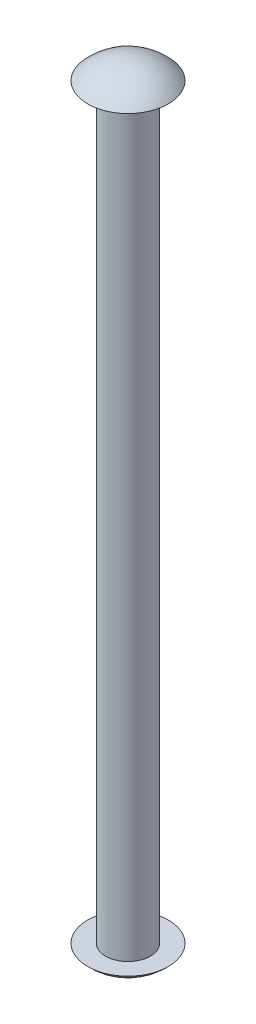
ISO-10303-21;
HEADER;
FILE_DESCRIPTION(('STEP AP214'),'2;1');
FILE_NAME('part.step','',(''),(''),'','','');
FILE_SCHEMA(('AUTOMOTIVE_DESIGN { 1 0 10303 214 1 1 1 1 }'));
ENDSEC;
DATA;
#1=APPLICATION_CONTEXT('core data for automotive mechanical design processes');
#2=APPLICATION_PROTOCOL_DEFINITION('international standard','automotive_design',2000,#1);
#3=PRODUCT_CONTEXT('',#1,'mechanical');
#4=PRODUCT('Part','Part','',(#3));
#5=PRODUCT_RELATED_PRODUCT_CATEGORY('part','',(#4));
#6=PRODUCT_DEFINITION_FORMATION('','',#4);
#7=PRODUCT_DEFINITION_CONTEXT('part definition',#1,'design');
#8=PRODUCT_DEFINITION('design','',#6,#7);
#9=PRODUCT_DEFINITION_SHAPE('','',#8);
#10=(LENGTH_UNIT() NAMED_UNIT(*) SI_UNIT(.MILLI.,.METRE.));
#11=(NAMED_UNIT(*) PLANE_ANGLE_UNIT() SI_UNIT($,.RADIAN.));
#12=(NAMED_UNIT(*) SI_UNIT($,.STERADIAN.) SOLID_ANGLE_UNIT());
#13=UNCERTAINTY_MEASURE_WITH_UNIT(LENGTH_MEASURE(1.E-05),#10,'distance_accuracy_value','');
#14=(GEOMETRIC_REPRESENTATION_CONTEXT(3) GLOBAL_UNCERTAINTY_ASSIGNED_CONTEXT((#13)) GLOBAL_UNIT_ASSIGNED_CONTEXT((#10,
#11,#12)) REPRESENTATION_CONTEXT('',''));
#15=CARTESIAN_POINT('',(0.,0.,0.));
#16=DIRECTION('',(0.,0.,1.));
#17=DIRECTION('',(1.,0.,0.));
#18=AXIS2_PLACEMENT_3D('',#15,#16,#17);
#19=CARTESIAN_POINT('',(0.,-11.2820472624,0.));
#20=DIRECTION('',(-0.479425538604204,0.,0.877582561890372));
#21=DIRECTION('',(-0.877582561890372,0.,-0.479425538604204));
#22=AXIS2_PLACEMENT_3D('',#19,#20,#21);
#23=SPHERICAL_SURFACE('',#22,1.81795273756);
#24=CARTESIAN_POINT('',(-0.647054575696604,-12.5,1.1844254560945));
#25=CARTESIAN_POINT('',(-0.580572309359393,-12.5,1.22073999622456));
#26=CARTESIAN_POINT('',(-0.510901264459944,-12.5,1.25149872853444));
#27=CARTESIAN_POINT('',(-0.403335343725967,-12.5,1.28853208592338));
#28=CARTESIAN_POINT('',(-0.366920460423315,-12.5,1.29936727502871));
#29=CARTESIAN_POINT('',(-0.293272392892864,-12.5,1.31794404286441));
#30=CARTESIAN_POINT('',(-0.256038567305152,-12.5,1.3256830987115));
#31=CARTESIAN_POINT('',(-0.143685314843215,-12.5,1.34411440615743));
#32=CARTESIAN_POINT('',(-0.0677405760305471,-12.5,1.35008032659965));
#33=CARTESIAN_POINT('',(0.0840750076652118,-12.5,1.34916147920787));
#34=CARTESIAN_POINT('',(0.159945849629215,-12.5,1.34227622280454));
#35=CARTESIAN_POINT('',(0.272030275586041,-12.5,1.3224932858284));
#36=CARTESIAN_POINT('',(0.309128472166256,-12.5,1.31431468400686));
#37=CARTESIAN_POINT('',(0.382468845225294,-12.5,1.29487413459596));
#38=CARTESIAN_POINT('',(0.418711812550447,-12.5,1.28361516741905));
#39=CARTESIAN_POINT('',(0.525850532726818,-12.4999999999999,1.24529811038744));
#40=CARTESIAN_POINT('',(0.595180362843019,-12.4999999999996,1.21369555883537));
#41=CARTESIAN_POINT('',(0.727510708931312,-12.4999999999996,1.13931559030197));
#42=CARTESIAN_POINT('',(0.790511463502336,-12.4999999999999,1.09653859480349));
#43=CARTESIAN_POINT('',(0.90844633255179,-12.5000000000001,1.00101129666473));
#44=CARTESIAN_POINT('',(0.963380533180291,-12.5,0.948261100551108));
#45=CARTESIAN_POINT('',(1.06361085023741,-12.4999999999999,0.834287376057859));
#46=CARTESIAN_POINT('',(1.10890691519323,-12.5,0.77306380242875));
#47=CARTESIAN_POINT('',(1.1885784664265,-12.5,0.643881525077535));
#48=CARTESIAN_POINT('',(1.22295395270394,-12.5,0.575922821355429));
#49=CARTESIAN_POINT('',(1.27980668790745,-12.5,0.435196516664037));
#50=CARTESIAN_POINT('',(1.30228400037355,-12.5,0.362428941377991));
#51=CARTESIAN_POINT('',(1.33470583492995,-12.5,0.214162550475124));
#52=CARTESIAN_POINT('',(1.34465022315744,-12.5,0.138663705694769));
#53=CARTESIAN_POINT('',(1.35171308507704,-12.5,-0.0129734144189699));
#54=CARTESIAN_POINT('',(1.3488310750328,-12.5,-0.0891117137607319));
#55=CARTESIAN_POINT('',(1.33497694388597,-12.5,-0.202049596115495));
#56=CARTESIAN_POINT('',(1.32876862038774,-12.5,-0.239489865101792));
#57=CARTESIAN_POINT('',(1.31321851468431,-12.5,-0.313752503719446));
#58=CARTESIAN_POINT('',(1.30387371421964,-12.5,-0.35057424215664));
#59=CARTESIAN_POINT('',(1.27123766487859,-12.5,-0.459611719295869));
#60=CARTESIAN_POINT('',(1.24333241773423,-12.5,-0.530499578608161));
#61=CARTESIAN_POINT('',(1.1760046820643,-12.5,-0.666572322914186));
#62=CARTESIAN_POINT('',(1.13658263142779,-12.5,-0.731757424614341));
#63=CARTESIAN_POINT('',(1.06967819397802,-12.5,-0.823881051781706));
#64=CARTESIAN_POINT('',(1.04604871459709,-12.5,-0.853678676812688));
#65=CARTESIAN_POINT('',(0.996388744632988,-12.5,-0.911150596367854));
#66=CARTESIAN_POINT('',(0.970360220561648,-12.5,-0.938826596504465));
#67=CARTESIAN_POINT('',(0.888982246640514,-12.5,-1.01832201916097));
#68=CARTESIAN_POINT('',(0.830221897443789,-12.5,-1.06677174024346));
#69=CARTESIAN_POINT('',(0.748448885990586,-12.5,-1.12335760969683));
#70=CARTESIAN_POINT('',(0.728623909462834,-12.5,-1.13631466246191));
#71=CARTESIAN_POINT('',(0.688321418043443,-12.5,-1.16117071915782));
#72=CARTESIAN_POINT('',(0.667843903151804,-12.5,-1.17306972308865));
#73=CARTESIAN_POINT('',(0.580572309359392,-12.5,-1.22073999622455));
#74=CARTESIAN_POINT('',(0.510901264459943,-12.5,-1.25149872853444));
#75=CARTESIAN_POINT('',(0.403335343725967,-12.5,-1.28853208592338));
#76=CARTESIAN_POINT('',(0.366920460423316,-12.5,-1.29936727502871));
#77=CARTESIAN_POINT('',(0.293272392892864,-12.5,-1.31794404286441));
#78=CARTESIAN_POINT('',(0.256038567305152,-12.5,-1.3256830987115));
#79=CARTESIAN_POINT('',(0.143685314843215,-12.5,-1.34411440615743));
#80=CARTESIAN_POINT('',(0.0677405760305468,-12.5,-1.35008032659965));
#81=CARTESIAN_POINT('',(-0.0840750076652117,-12.5,-1.34916147920787));
#82=CARTESIAN_POINT('',(-0.159945849629215,-12.5,-1.34227622280454));
#83=CARTESIAN_POINT('',(-0.272030275586041,-12.5,-1.3224932858284));
#84=CARTESIAN_POINT('',(-0.309128472166255,-12.5,-1.31431468400686));
#85=CARTESIAN_POINT('',(-0.382468845225294,-12.5,-1.29487413459596));
#86=CARTESIAN_POINT('',(-0.418711812550447,-12.5,-1.28361516741905));
#87=CARTESIAN_POINT('',(-0.525850532726818,-12.4999999999999,-1.24529811038744));
#88=CARTESIAN_POINT('',(-0.595180362843019,-12.4999999999996,-1.21369555883537));
#89=CARTESIAN_POINT('',(-0.727510708931312,-12.4999999999996,-1.13931559030197));
#90=CARTESIAN_POINT('',(-0.790511463502336,-12.4999999999999,-1.09653859480349));
#91=CARTESIAN_POINT('',(-0.908446332551789,-12.5000000000001,-1.00101129666473));
#92=CARTESIAN_POINT('',(-0.96338053318029,-12.5,-0.948261100551107));
#93=CARTESIAN_POINT('',(-1.06361085023741,-12.4999999999999,-0.834287376057858));
#94=CARTESIAN_POINT('',(-1.10890691519323,-12.5,-0.77306380242875));
#95=CARTESIAN_POINT('',(-1.1885784664265,-12.5,-0.643881525077534));
#96=CARTESIAN_POINT('',(-1.22295395270394,-12.5,-0.575922821355428));
#97=CARTESIAN_POINT('',(-1.27980668790745,-12.5,-0.435196516664036));
#98=CARTESIAN_POINT('',(-1.30228400037355,-12.5,-0.36242894137799));
#99=CARTESIAN_POINT('',(-1.33470583492995,-12.5,-0.214162550475123));
#100=CARTESIAN_POINT('',(-1.34465022315744,-12.5,-0.138663705694768));
#101=CARTESIAN_POINT('',(-1.35171308507703,-12.5,0.012973414418971));
#102=CARTESIAN_POINT('',(-1.3488310750328,-12.5,0.0891117137607329));
#103=CARTESIAN_POINT('',(-1.33497694388597,-12.5,0.202049596115496));
#104=CARTESIAN_POINT('',(-1.32876862038774,-12.5,0.239489865101793));
#105=CARTESIAN_POINT('',(-1.31321851468431,-12.5,0.313752503719447));
#106=CARTESIAN_POINT('',(-1.30387371421964,-12.5,0.350574242156641));
#107=CARTESIAN_POINT('',(-1.27123766487859,-12.5,0.45961171929587));
#108=CARTESIAN_POINT('',(-1.24333241773423,-12.5,0.530499578608161));
#109=CARTESIAN_POINT('',(-1.17600468206429,-12.5,0.666572322914185));
#110=CARTESIAN_POINT('',(-1.13658263142779,-12.5,0.731757424614341));
#111=CARTESIAN_POINT('',(-1.06967819397802,-12.5,0.823881051781706));
#112=CARTESIAN_POINT('',(-1.0460487145971,-12.5,0.853678676812688));
#113=CARTESIAN_POINT('',(-0.996388744632988,-12.5,0.911150596367855));
#114=CARTESIAN_POINT('',(-0.970360220561647,-12.5,0.938826596504466));
#115=CARTESIAN_POINT('',(-0.888982246640512,-12.5,1.01832201916097));
#116=CARTESIAN_POINT('',(-0.830221897443789,-12.5,1.06677174024346));
#117=CARTESIAN_POINT('',(-0.748448885990586,-12.5,1.12335760969683));
#118=CARTESIAN_POINT('',(-0.728623909462834,-12.5,1.13631466246191));
#119=CARTESIAN_POINT('',(-0.688321418043443,-12.5,1.16117071915782));
#120=CARTESIAN_POINT('',(-0.667843903151804,-12.5,1.17306972308865));
#121=CARTESIAN_POINT('',(-0.647054575696604,-12.5,1.1844254560945));
#122=B_SPLINE_CURVE_WITH_KNOTS('',3,(#24,#25,#26,#27,#28,#29,#30,#31,#32,#33,#34,#35,#36,#37,
#38,#39,#40,#41,#42,#43,#44,#45,#46,#47,#48,#49,#50,#51,#52,#53,#54,#55,#56,#57,#58,#59,#60,#61,
#62,#63,#64,#65,#66,#67,#68,#69,#70,#71,#72,#73,#74,#75,#76,#77,#78,#79,#80,#81,#82,#83,#84,#85,
#86,#87,#88,#89,#90,#91,#92,#93,#94,#95,#96,#97,#98,#99,#100,#101,#102,#103,#104,#105,#106,#107,
#108,#109,#110,#111,#112,#113,#114,#115,#116,#117,#118,#119,#120,#121),.UNSPECIFIED.,.T.,.F.,(4,
2,2,2,2,2,2,2,2,2,2,2,2,2,2,2,2,2,2,2,2,2,2,2,2,2,2,2,2,2,2,2,2,2,2,2,2,2,2,2,2,2,2,2,2,2,2,2,
4),(0.,0.227151157360228,0.341025276432895,0.454991997722162,0.682382174404643,
0.909780996064256,1.02362939559812,1.13736802812751,1.36477231777223,1.59216803131495,
1.81956131611521,2.04695581528656,2.2743503144579,2.50174359925797,2.72913931280054,
2.95654360244543,3.07028223497489,3.18413063450884,3.41152945616846,3.63891963285093,
3.7528863541402,3.86676047321287,4.09391163057309,4.16494290029903,4.23597417002496,
4.46312532738519,4.57699944645785,4.69096616774712,4.9183563444296,5.14575516608921,
5.25960356562308,5.37334219815247,5.60074648779718,5.8281422013399,6.05553548614016,
6.28292998531152,6.51032448448286,6.73771776928293,6.9651134828255,7.19251777247039,
7.30625640499985,7.4201048045338,7.64750362619342,7.87489380287589,7.98886052416516,
8.10273464323783,8.32988580059805,8.40091707032398,8.47194834004991),.UNSPECIFIED.);
#123=CARTESIAN_POINT('',(-0.647054575696604,-12.5,1.1844254560945));
#124=VERTEX_POINT('',#123);
#125=EDGE_CURVE('E20',#124,#124,#122,.T.);
#126=ORIENTED_EDGE('',*,*,#125,.F.);
#127=EDGE_LOOP('',(#126));
#128=FACE_BOUND('',#127,.T.);
#129=ADVANCED_FACE('F15',(#128),#23,.T.);
#130=CARTESIAN_POINT('',(0.,11.2820472624,0.));
#131=DIRECTION('',(0.479425538604204,0.,0.877582561890372));
#132=DIRECTION('',(0.877582561890372,0.,-0.479425538604204));
#133=AXIS2_PLACEMENT_3D('',#130,#131,#132);
#134=SPHERICAL_SURFACE('',#133,1.81795273756);
#135=CARTESIAN_POINT('',(0.647054575696604,12.5,1.1844254560945));
#136=CARTESIAN_POINT('',(0.713532729344129,12.5,1.14810338773646));
#137=CARTESIAN_POINT('',(0.777058736323906,12.5,1.10609623896512));
#138=CARTESIAN_POINT('',(0.866339347042319,12.5,1.03559184610487));
#139=CARTESIAN_POINT('',(0.895131889705772,12.5,1.01080405604873));
#140=CARTESIAN_POINT('',(0.950555921540608,12.5,0.958868414632048));
#141=CARTESIAN_POINT('',(0.977185634307156,12.5,0.931718660466093));
#142=CARTESIAN_POINT('',(1.05339976611219,12.5,0.847135136383992));
#143=CARTESIAN_POINT('',(1.0994530325612,12.5,0.786453242796005));
#144=CARTESIAN_POINT('',(1.18070615907945,12.5,0.658208378710063));
#145=CARTESIAN_POINT('',(1.21590560645459,12.5,0.590645146693297));
#146=CARTESIAN_POINT('',(1.25981831279156,12.5,0.485640587936849));
#147=CARTESIAN_POINT('',(1.27298049781837,12.5,0.450004614502979));
#148=CARTESIAN_POINT('',(1.29624781223761,12.5,0.377787044884827));
#149=CARTESIAN_POINT('',(1.30635587685672,12.5,0.341206393550018));
#150=CARTESIAN_POINT('',(1.33200048270076,12.4999999999999,0.230349474903962));
#151=CARTESIAN_POINT('',(1.34286691960125,12.4999999999996,0.154935503004651));
#152=CARTESIAN_POINT('',(1.35177672535773,12.4999999999996,0.0033956878527953));
#153=CARTESIAN_POINT('',(1.34982057779487,12.4999999999999,-0.0727301284456727));
#154=CARTESIAN_POINT('',(1.33315760984412,12.5000000000001,-0.223582518305678));
#155=CARTESIAN_POINT('',(1.3184509256424,12.5,-0.298309106803404));
#156=CARTESIAN_POINT('',(1.27670001487511,12.4999999999999,-0.444230276557267));
#157=CARTESIAN_POINT('',(1.24965572242255,12.5,-0.51542483894894));
#158=CARTESIAN_POINT('',(1.18399930712391,12.5,-0.652263619956713));
#159=CARTESIAN_POINT('',(1.14538718427783,12.5,-0.717907838572814));
#160=CARTESIAN_POINT('',(1.05768774600651,12.5,-0.841782512574844));
#161=CARTESIAN_POINT('',(1.00860048652379,12.5,-0.900013007551156));
#162=CARTESIAN_POINT('',(0.901356212528449,12.5,-1.00740371349248));
#163=CARTESIAN_POINT('',(0.843199101149163,12.5,-1.05656382757294));
#164=CARTESIAN_POINT('',(0.71941694493506,12.5,-1.144436906601));
#165=CARTESIAN_POINT('',(0.653791618534024,12.5,-1.18314947747027));
#166=CARTESIAN_POINT('',(0.551272248442549,12.5,-1.23251222634692));
#167=CARTESIAN_POINT('',(0.516412976925555,12.5,-1.24751716592458));
#168=CARTESIAN_POINT('',(0.445521363305541,12.5,-1.27455647804962));
#169=CARTESIAN_POINT('',(0.409487921561553,12.5,-1.28658796978357));
#170=CARTESIAN_POINT('',(0.30010271557893,12.5,-1.318038881529));
#171=CARTESIAN_POINT('',(0.225375369414619,12.5,-1.33285829957783));
#172=CARTESIAN_POINT('',(0.0744967724266161,12.5,-1.34972438105354));
#173=CARTESIAN_POINT('',(-0.0016544241567651,12.5,-1.35177153003836));
#174=CARTESIAN_POINT('',(-0.115322405260302,12.5,-1.34524799535327));
#175=CARTESIAN_POINT('',(-0.153163304336048,12.5,-1.34146419958184));
#176=CARTESIAN_POINT('',(-0.228355653363914,12.5,-1.33072898640916));
#177=CARTESIAN_POINT('',(-0.265707476028521,12.5,-1.32378014531687));
#178=CARTESIAN_POINT('',(-0.376569274575549,12.5,-1.29825450162737));
#179=CARTESIAN_POINT('',(-0.449086661253173,12.5,-1.27498686874089));
#180=CARTESIAN_POINT('',(-0.540884175194366,12.5,-1.23675072800813));
#181=CARTESIAN_POINT('',(-0.562498639676563,12.5,-1.22706931097182));
#182=CARTESIAN_POINT('',(-0.605189819229098,12.5,-1.20658571857464));
#183=CARTESIAN_POINT('',(-0.626266534299435,12.5,-1.19578354321378));
#184=CARTESIAN_POINT('',(-0.713532729344128,12.5,-1.14810338773646));
#185=CARTESIAN_POINT('',(-0.777058736323905,12.5,-1.10609623896512));
#186=CARTESIAN_POINT('',(-0.866339347042319,12.5,-1.03559184610487));
#187=CARTESIAN_POINT('',(-0.895131889705773,12.5,-1.01080405604873));
#188=CARTESIAN_POINT('',(-0.950555921540608,12.5,-0.95886841463205));
#189=CARTESIAN_POINT('',(-0.977185634307156,12.5,-0.931718660466094));
#190=CARTESIAN_POINT('',(-1.05339976611219,12.5,-0.847135136383992));
#191=CARTESIAN_POINT('',(-1.0994530325612,12.5,-0.786453242796005));
#192=CARTESIAN_POINT('',(-1.18070615907945,12.5,-0.658208378710063));
#193=CARTESIAN_POINT('',(-1.21590560645459,12.5,-0.590645146693298));
#194=CARTESIAN_POINT('',(-1.25981831279156,12.5,-0.48564058793685));
#195=CARTESIAN_POINT('',(-1.27298049781837,12.5,-0.450004614502981));
#196=CARTESIAN_POINT('',(-1.29624781223761,12.5,-0.377787044884829));
#197=CARTESIAN_POINT('',(-1.30635587685672,12.5,-0.34120639355002));
#198=CARTESIAN_POINT('',(-1.33200048270076,12.4999999999999,-0.230349474903964));
#199=CARTESIAN_POINT('',(-1.34286691960125,12.4999999999996,-0.154935503004653));
#200=CARTESIAN_POINT('',(-1.35177672535773,12.4999999999996,-0.00339568785279738));
#201=CARTESIAN_POINT('',(-1.34982057779487,12.4999999999999,0.0727301284456709));
#202=CARTESIAN_POINT('',(-1.33315760984412,12.5000000000001,0.223582518305676));
#203=CARTESIAN_POINT('',(-1.3184509256424,12.5,0.298309106803403));
#204=CARTESIAN_POINT('',(-1.27670001487511,12.4999999999999,0.444230276557266));
#205=CARTESIAN_POINT('',(-1.24965572242255,12.5,0.515424838948939));
#206=CARTESIAN_POINT('',(-1.18399930712391,12.5,0.652263619956712));
#207=CARTESIAN_POINT('',(-1.14538718427783,12.5,0.717907838572813));
#208=CARTESIAN_POINT('',(-1.05768774600651,12.5,0.841782512574843));
#209=CARTESIAN_POINT('',(-1.0086004865238,12.5,0.900013007551156));
#210=CARTESIAN_POINT('',(-0.901356212528451,12.5,1.00740371349248));
#211=CARTESIAN_POINT('',(-0.843199101149165,12.5,1.05656382757294));
#212=CARTESIAN_POINT('',(-0.719416944935061,12.5,1.144436906601));
#213=CARTESIAN_POINT('',(-0.653791618534025,12.5,1.18314947747027));
#214=CARTESIAN_POINT('',(-0.55127224844255,12.5,1.23251222634692));
#215=CARTESIAN_POINT('',(-0.516412976925556,12.5,1.24751716592458));
#216=CARTESIAN_POINT('',(-0.445521363305542,12.5,1.27455647804962));
#217=CARTESIAN_POINT('',(-0.409487921561555,12.5,1.28658796978357));
#218=CARTESIAN_POINT('',(-0.300102715578931,12.5,1.318038881529));
#219=CARTESIAN_POINT('',(-0.22537536941462,12.5,1.33285829957783));
#220=CARTESIAN_POINT('',(-0.0744967724266173,12.5,1.34972438105354));
#221=CARTESIAN_POINT('',(0.00165442415676387,12.5,1.35177153003836));
#222=CARTESIAN_POINT('',(0.1153224052603,12.5,1.34524799535327));
#223=CARTESIAN_POINT('',(0.153163304336047,12.5,1.34146419958184));
#224=CARTESIAN_POINT('',(0.228355653363913,12.5,1.33072898640916));
#225=CARTESIAN_POINT('',(0.26570747602852,12.5,1.32378014531687));
#226=CARTESIAN_POINT('',(0.376569274575548,12.5,1.29825450162737));
#227=CARTESIAN_POINT('',(0.449086661253173,12.5,1.27498686874089));
#228=CARTESIAN_POINT('',(0.540884175194365,12.5,1.23675072800813));
#229=CARTESIAN_POINT('',(0.562498639676562,12.5,1.22706931097182));
#230=CARTESIAN_POINT('',(0.605189819229097,12.5,1.20658571857464));
#231=CARTESIAN_POINT('',(0.626266534299434,12.5,1.19578354321378));
#232=CARTESIAN_POINT('',(0.647054575696604,12.5,1.1844254560945));
#233=B_SPLINE_CURVE_WITH_KNOTS('',3,(#135,#136,#137,#138,#139,#140,#141,#142,#143,#144,#145,
#146,#147,#148,#149,#150,#151,#152,#153,#154,#155,#156,#157,#158,#159,#160,#161,#162,#163,#164,
#165,#166,#167,#168,#169,#170,#171,#172,#173,#174,#175,#176,#177,#178,#179,#180,#181,#182,#183,
#184,#185,#186,#187,#188,#189,#190,#191,#192,#193,#194,#195,#196,#197,#198,#199,#200,#201,#202,
#203,#204,#205,#206,#207,#208,#209,#210,#211,#212,#213,#214,#215,#216,#217,#218,#219,#220,#221,
#222,#223,#224,#225,#226,#227,#228,#229,#230,#231,#232),.UNSPECIFIED.,.T.,.F.,(4,2,2,2,2,2,2,2,
2,2,2,2,2,2,2,2,2,2,2,2,2,2,2,2,2,2,2,2,2,2,2,2,2,2,2,2,2,2,2,2,2,2,2,2,2,2,2,2,4),(0.,
0.227151157360229,0.341025276432896,0.454991997722163,0.682382174404644,0.909780996064257,
1.02362939559812,1.13736802812751,1.36477231777223,1.59216803131495,1.81956131611521,
2.04695581528656,2.2743503144579,2.50174359925797,2.72913931280054,2.95654360244543,
3.0702822349749,3.18413063450884,3.41152945616846,3.63891963285093,3.7528863541402,
3.86676047321287,4.0939116305731,4.16494290029903,4.23597417002496,4.46312532738519,
4.57699944645785,4.69096616774712,4.9183563444296,5.14575516608921,5.25960356562308,
5.37334219815247,5.60074648779718,5.8281422013399,6.05553548614016,6.28292998531152,
6.51032448448286,6.73771776928293,6.96511348282549,7.19251777247039,7.30625640499985,
7.4201048045338,7.64750362619342,7.87489380287589,7.98886052416516,8.10273464323783,
8.32988580059805,8.40091707032398,8.47194834004991),.UNSPECIFIED.);
#234=CARTESIAN_POINT('',(0.647054575696604,12.5,1.1844254560945));
#235=VERTEX_POINT('',#234);
#236=EDGE_CURVE('E32',#235,#235,#233,.T.);
#237=ORIENTED_EDGE('',*,*,#236,.T.);
#238=EDGE_LOOP('',(#237));
#239=FACE_BOUND('',#238,.T.);
#240=ADVANCED_FACE('F43',(#239),#134,.T.);
#241=CARTESIAN_POINT('',(0.,-12.5,0.));
#242=DIRECTION('',(0.,1.,0.));
#243=DIRECTION('',(0.,0.,1.));
#244=AXIS2_PLACEMENT_3D('',#241,#242,#243);
#245=PLANE('',#244);
#246=CARTESIAN_POINT('',(0.,-12.5,0.));
#247=DIRECTION('',(0.,1.,0.));
#248=DIRECTION('',(0.,0.,1.));
#249=AXIS2_PLACEMENT_3D('',#246,#247,#248);
#250=CIRCLE('',#249,0.75);
#251=CARTESIAN_POINT('',(0.,-12.5,0.75));
#252=VERTEX_POINT('',#251);
#253=EDGE_CURVE('E27',#252,#252,#250,.T.);
#254=ORIENTED_EDGE('',*,*,#253,.F.);
#255=EDGE_LOOP('',(#254));
#256=FACE_BOUND('',#255,.T.);
#257=ORIENTED_EDGE('',*,*,#125,.T.);
#258=EDGE_LOOP('',(#257));
#259=FACE_BOUND('',#258,.T.);
#260=ADVANCED_FACE('F46',(#256,#259),#245,.T.);
#261=CARTESIAN_POINT('',(0.,12.5,0.));
#262=DIRECTION('',(0.,1.,0.));
#263=DIRECTION('',(0.,0.,1.));
#264=AXIS2_PLACEMENT_3D('',#261,#262,#263);
#265=PLANE('',#264);
#266=CARTESIAN_POINT('',(0.,12.5,0.));
#267=DIRECTION('',(0.,1.,0.));
#268=DIRECTION('',(0.,0.,1.));
#269=AXIS2_PLACEMENT_3D('',#266,#267,#268);
#270=CIRCLE('',#269,0.75);
#271=CARTESIAN_POINT('',(0.,12.5,0.75));
#272=VERTEX_POINT('',#271);
#273=EDGE_CURVE('E10',#272,#272,#270,.F.);
#274=ORIENTED_EDGE('',*,*,#273,.F.);
#275=EDGE_LOOP('',(#274));
#276=FACE_BOUND('',#275,.T.);
#277=ORIENTED_EDGE('',*,*,#236,.F.);
#278=EDGE_LOOP('',(#277));
#279=FACE_BOUND('',#278,.T.);
#280=ADVANCED_FACE('F40',(#276,#279),#265,.F.);
#281=CARTESIAN_POINT('',(0.,0.,0.));
#282=DIRECTION('',(0.,1.,0.));
#283=DIRECTION('',(0.,0.,1.));
#284=AXIS2_PLACEMENT_3D('',#281,#282,#283);
#285=CYLINDRICAL_SURFACE('',#284,0.75);
#286=ORIENTED_EDGE('',*,*,#253,.T.);
#287=EDGE_LOOP('',(#286));
#288=FACE_BOUND('',#287,.T.);
#289=ORIENTED_EDGE('',*,*,#273,.T.);
#290=EDGE_LOOP('',(#289));
#291=FACE_BOUND('',#290,.T.);
#292=ADVANCED_FACE('F56',(#288,#291),#285,.T.);
#293=CLOSED_SHELL('',(#129,#240,#260,#280,#292));
#294=MANIFOLD_SOLID_BREP('B1',#293);
#295=ADVANCED_BREP_SHAPE_REPRESENTATION('',(#18,#294),#14);
#296=SHAPE_DEFINITION_REPRESENTATION(#9,#295);
ENDSEC;
END-ISO-10303-21;
